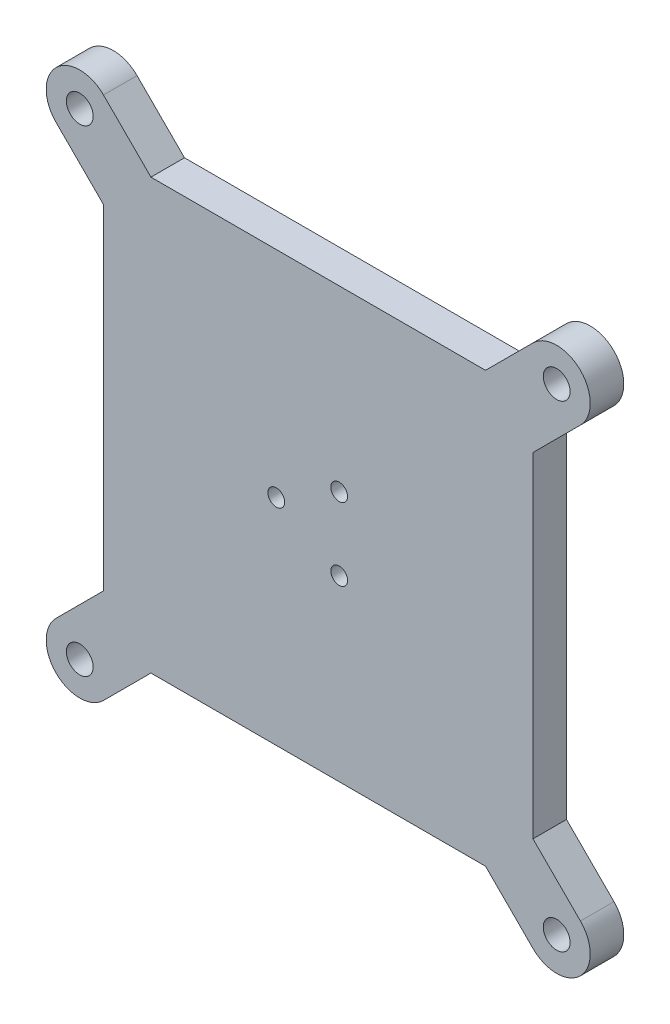
ISO-10303-21;
HEADER;
FILE_DESCRIPTION(('STEP AP214'),'2;1');
FILE_NAME('part.step','',(''),(''),'','','');
FILE_SCHEMA(('AUTOMOTIVE_DESIGN { 1 0 10303 214 1 1 1 1 }'));
ENDSEC;
DATA;
#1=APPLICATION_CONTEXT('core data for automotive mechanical design processes');
#2=APPLICATION_PROTOCOL_DEFINITION('international standard','automotive_design',2000,#1);
#3=PRODUCT_CONTEXT('',#1,'mechanical');
#4=PRODUCT('Part','Part','',(#3));
#5=PRODUCT_RELATED_PRODUCT_CATEGORY('part','',(#4));
#6=PRODUCT_DEFINITION_FORMATION('','',#4);
#7=PRODUCT_DEFINITION_CONTEXT('part definition',#1,'design');
#8=PRODUCT_DEFINITION('design','',#6,#7);
#9=PRODUCT_DEFINITION_SHAPE('','',#8);
#10=(LENGTH_UNIT() NAMED_UNIT(*) SI_UNIT(.MILLI.,.METRE.));
#11=(NAMED_UNIT(*) PLANE_ANGLE_UNIT() SI_UNIT($,.RADIAN.));
#12=(NAMED_UNIT(*) SI_UNIT($,.STERADIAN.) SOLID_ANGLE_UNIT());
#13=UNCERTAINTY_MEASURE_WITH_UNIT(LENGTH_MEASURE(1.E-05),#10,'distance_accuracy_value','');
#14=(GEOMETRIC_REPRESENTATION_CONTEXT(3) GLOBAL_UNCERTAINTY_ASSIGNED_CONTEXT((#13)) GLOBAL_UNIT_ASSIGNED_CONTEXT((#10,
#11,#12)) REPRESENTATION_CONTEXT('',''));
#15=CARTESIAN_POINT('',(0.,0.,0.));
#16=DIRECTION('',(0.,0.,1.));
#17=DIRECTION('',(1.,0.,0.));
#18=AXIS2_PLACEMENT_3D('',#15,#16,#17);
#19=CARTESIAN_POINT('',(3.125,-5.41265877365274,5.));
#20=DIRECTION('',(0.,0.,-1.));
#21=DIRECTION('',(-1.,0.,0.));
#22=AXIS2_PLACEMENT_3D('',#19,#20,#21);
#23=CYLINDRICAL_SURFACE('',#22,1.24999999999921);
#24=CARTESIAN_POINT('',(3.125,-5.41265877365274,5.));
#25=DIRECTION('',(0.,0.,1.));
#26=DIRECTION('',(1.,0.,0.));
#27=AXIS2_PLACEMENT_3D('',#24,#25,#26);
#28=CIRCLE('',#27,1.24999999999921);
#29=CARTESIAN_POINT('',(4.37499999999921,-5.41265877365274,5.));
#30=VERTEX_POINT('',#29);
#31=EDGE_CURVE('E185',#30,#30,#28,.T.);
#32=ORIENTED_EDGE('',*,*,#31,.T.);
#33=EDGE_LOOP('',(#32));
#34=FACE_BOUND('',#33,.T.);
#35=CARTESIAN_POINT('',(3.125,-5.41265877365274,1.5));
#36=DIRECTION('',(0.,0.,-1.));
#37=DIRECTION('',(-1.,0.,0.));
#38=AXIS2_PLACEMENT_3D('',#35,#36,#37);
#39=CIRCLE('',#38,1.24999999999921);
#40=CARTESIAN_POINT('',(1.87500000000079,-5.41265877365274,1.5));
#41=VERTEX_POINT('',#40);
#42=EDGE_CURVE('E37',#41,#41,#39,.T.);
#43=ORIENTED_EDGE('',*,*,#42,.T.);
#44=EDGE_LOOP('',(#43));
#45=FACE_BOUND('',#44,.T.);
#46=ADVANCED_FACE('F33',(#34,#45),#23,.F.);
#47=CARTESIAN_POINT('',(-6.25,0.,5.));
#48=DIRECTION('',(0.,0.,-1.));
#49=DIRECTION('',(-1.,0.,0.));
#50=AXIS2_PLACEMENT_3D('',#47,#48,#49);
#51=CYLINDRICAL_SURFACE('',#50,1.25000000000024);
#52=CARTESIAN_POINT('',(-6.25,0.,5.));
#53=DIRECTION('',(0.,0.,1.));
#54=DIRECTION('',(1.,0.,0.));
#55=AXIS2_PLACEMENT_3D('',#52,#53,#54);
#56=CIRCLE('',#55,1.25000000000024);
#57=CARTESIAN_POINT('',(-4.99999999999976,0.,5.));
#58=VERTEX_POINT('',#57);
#59=EDGE_CURVE('E289',#58,#58,#56,.T.);
#60=ORIENTED_EDGE('',*,*,#59,.T.);
#61=EDGE_LOOP('',(#60));
#62=FACE_BOUND('',#61,.T.);
#63=CARTESIAN_POINT('',(-6.25,0.,1.5));
#64=DIRECTION('',(0.,0.,-1.));
#65=DIRECTION('',(-1.,0.,0.));
#66=AXIS2_PLACEMENT_3D('',#63,#64,#65);
#67=CIRCLE('',#66,1.25000000000024);
#68=CARTESIAN_POINT('',(-7.50000000000024,0.,1.5));
#69=VERTEX_POINT('',#68);
#70=EDGE_CURVE('E250',#69,#69,#67,.T.);
#71=ORIENTED_EDGE('',*,*,#70,.T.);
#72=EDGE_LOOP('',(#71));
#73=FACE_BOUND('',#72,.T.);
#74=ADVANCED_FACE('F347',(#62,#73),#51,.F.);
#75=CARTESIAN_POINT('',(3.125,5.41265877365274,5.));
#76=DIRECTION('',(0.,0.,-1.));
#77=DIRECTION('',(-1.,0.,0.));
#78=AXIS2_PLACEMENT_3D('',#75,#76,#77);
#79=CYLINDRICAL_SURFACE('',#78,1.25000000000055);
#80=CARTESIAN_POINT('',(3.125,5.41265877365274,5.));
#81=DIRECTION('',(0.,0.,1.));
#82=DIRECTION('',(1.,0.,0.));
#83=AXIS2_PLACEMENT_3D('',#80,#81,#82);
#84=CIRCLE('',#83,1.25000000000055);
#85=CARTESIAN_POINT('',(4.37500000000055,5.41265877365274,5.));
#86=VERTEX_POINT('',#85);
#87=EDGE_CURVE('E284',#86,#86,#84,.T.);
#88=ORIENTED_EDGE('',*,*,#87,.T.);
#89=EDGE_LOOP('',(#88));
#90=FACE_BOUND('',#89,.T.);
#91=CARTESIAN_POINT('',(3.125,5.41265877365274,1.5));
#92=DIRECTION('',(0.,0.,-1.));
#93=DIRECTION('',(-1.,0.,0.));
#94=AXIS2_PLACEMENT_3D('',#91,#92,#93);
#95=CIRCLE('',#94,1.25000000000055);
#96=CARTESIAN_POINT('',(1.87499999999945,5.41265877365274,1.5));
#97=VERTEX_POINT('',#96);
#98=EDGE_CURVE('E248',#97,#97,#95,.T.);
#99=ORIENTED_EDGE('',*,*,#98,.T.);
#100=EDGE_LOOP('',(#99));
#101=FACE_BOUND('',#100,.T.);
#102=ADVANCED_FACE('F353',(#90,#101),#79,.F.);
#103=CARTESIAN_POINT('',(-35.5355339059324,-35.5355339059331,5.));
#104=DIRECTION('',(0.,0.,1.));
#105=DIRECTION('',(1.,0.,0.));
#106=AXIS2_PLACEMENT_3D('',#103,#104,#105);
#107=PLANE('',#106);
#108=CARTESIAN_POINT('',(35.5355339059326,35.5355339059329,5.));
#109=DIRECTION('',(0.,0.,1.));
#110=DIRECTION('',(1.,0.,0.));
#111=AXIS2_PLACEMENT_3D('',#108,#109,#110);
#112=CIRCLE('',#111,2.);
#113=CARTESIAN_POINT('',(37.5355339059326,35.5355339059329,5.));
#114=VERTEX_POINT('',#113);
#115=EDGE_CURVE('E269',#114,#114,#112,.T.);
#116=ORIENTED_EDGE('',*,*,#115,.F.);
#117=EDGE_LOOP('',(#116));
#118=FACE_BOUND('',#117,.T.);
#119=CARTESIAN_POINT('',(-35.5355339059324,-35.5355339059331,5.));
#120=DIRECTION('',(0.,0.,1.));
#121=DIRECTION('',(1.,0.,0.));
#122=AXIS2_PLACEMENT_3D('',#119,#120,#121);
#123=CIRCLE('',#122,2.);
#124=CARTESIAN_POINT('',(-33.5355339059324,-35.5355339059331,5.));
#125=VERTEX_POINT('',#124);
#126=EDGE_CURVE('E281',#125,#125,#123,.T.);
#127=ORIENTED_EDGE('',*,*,#126,.F.);
#128=EDGE_LOOP('',(#127));
#129=FACE_BOUND('',#128,.T.);
#130=ORIENTED_EDGE('',*,*,#59,.F.);
#131=EDGE_LOOP('',(#130));
#132=FACE_BOUND('',#131,.T.);
#133=DIRECTION('',(0.,-1.,0.));
#134=VECTOR('',#133,1.);
#135=CARTESIAN_POINT('',(-32.,24.9289321881345,5.));
#136=LINE('',#135,#134);
#137=CARTESIAN_POINT('',(-32.,24.9289321881345,5.));
#138=VERTEX_POINT('',#137);
#139=CARTESIAN_POINT('',(-32.,-24.9289321881352,5.));
#140=VERTEX_POINT('',#139);
#141=EDGE_CURVE('E212',#138,#140,#136,.T.);
#142=ORIENTED_EDGE('',*,*,#141,.T.);
#143=DIRECTION('',(-0.707106781186541,-0.707106781186555,0.));
#144=VECTOR('',#143,1.);
#145=CARTESIAN_POINT('',(-32.,-24.9289321881352,5.));
#146=LINE('',#145,#144);
#147=CARTESIAN_POINT('',(-39.0710678118651,-32.0000000000004,5.));
#148=VERTEX_POINT('',#147);
#149=EDGE_CURVE('E119',#140,#148,#146,.T.);
#150=ORIENTED_EDGE('',*,*,#149,.T.);
#151=CARTESIAN_POINT('',(-35.5355339059324,-35.5355339059331,5.));
#152=DIRECTION('',(0.,0.,1.));
#153=DIRECTION('',(1.,0.,0.));
#154=AXIS2_PLACEMENT_3D('',#151,#152,#153);
#155=CIRCLE('',#154,5.);
#156=CARTESIAN_POINT('',(-31.9999999999996,-39.0710678118658,5.));
#157=VERTEX_POINT('',#156);
#158=EDGE_CURVE('E296',#148,#157,#155,.T.);
#159=ORIENTED_EDGE('',*,*,#158,.T.);
#160=DIRECTION('',(0.70710678118654,0.707106781186555,0.));
#161=VECTOR('',#160,1.);
#162=CARTESIAN_POINT('',(-31.9999999999996,-39.0710678118658,5.));
#163=LINE('',#162,#161);
#164=CARTESIAN_POINT('',(-24.9289321881339,-32.,5.));
#165=VERTEX_POINT('',#164);
#166=EDGE_CURVE('E298',#157,#165,#163,.T.);
#167=ORIENTED_EDGE('',*,*,#166,.T.);
#168=DIRECTION('',(1.,0.,0.));
#169=VECTOR('',#168,1.);
#170=CARTESIAN_POINT('',(-24.9289321881339,-32.,5.));
#171=LINE('',#170,#169);
#172=CARTESIAN_POINT('',(24.9289321881345,-32.,5.));
#173=VERTEX_POINT('',#172);
#174=EDGE_CURVE('E300',#165,#173,#171,.T.);
#175=ORIENTED_EDGE('',*,*,#174,.T.);
#176=DIRECTION('',(0.707106781186547,-0.707106781186548,0.));
#177=VECTOR('',#176,1.);
#178=CARTESIAN_POINT('',(24.9289321881345,-32.,5.));
#179=LINE('',#178,#177);
#180=CARTESIAN_POINT('',(32.,-39.0710678118655,5.));
#181=VERTEX_POINT('',#180);
#182=EDGE_CURVE('E302',#173,#181,#179,.T.);
#183=ORIENTED_EDGE('',*,*,#182,.T.);
#184=CARTESIAN_POINT('',(35.5355339059327,-35.5355339059327,5.));
#185=DIRECTION('',(0.,0.,1.));
#186=DIRECTION('',(1.,0.,0.));
#187=AXIS2_PLACEMENT_3D('',#184,#185,#186);
#188=CIRCLE('',#187,5.);
#189=CARTESIAN_POINT('',(39.0710678118655,-32.,5.));
#190=VERTEX_POINT('',#189);
#191=EDGE_CURVE('E304',#181,#190,#188,.T.);
#192=ORIENTED_EDGE('',*,*,#191,.T.);
#193=DIRECTION('',(-0.707106781186548,0.707106781186547,0.));
#194=VECTOR('',#193,1.);
#195=CARTESIAN_POINT('',(39.0710678118655,-32.,5.));
#196=LINE('',#195,#194);
#197=CARTESIAN_POINT('',(32.,-24.9289321881345,5.));
#198=VERTEX_POINT('',#197);
#199=EDGE_CURVE('E306',#190,#198,#196,.T.);
#200=ORIENTED_EDGE('',*,*,#199,.T.);
#201=DIRECTION('',(0.,1.,0.));
#202=VECTOR('',#201,1.);
#203=CARTESIAN_POINT('',(32.,-24.9289321881345,5.));
#204=LINE('',#203,#202);
#205=CARTESIAN_POINT('',(32.,24.9289321881347,5.));
#206=VERTEX_POINT('',#205);
#207=EDGE_CURVE('E308',#198,#206,#204,.T.);
#208=ORIENTED_EDGE('',*,*,#207,.T.);
#209=DIRECTION('',(0.707106781186545,0.70710678118655,0.));
#210=VECTOR('',#209,1.);
#211=CARTESIAN_POINT('',(32.,24.9289321881347,5.));
#212=LINE('',#211,#210);
#213=CARTESIAN_POINT('',(39.0710678118654,32.0000000000001,5.));
#214=VERTEX_POINT('',#213);
#215=EDGE_CURVE('E310',#206,#214,#212,.T.);
#216=ORIENTED_EDGE('',*,*,#215,.T.);
#217=CARTESIAN_POINT('',(35.5355339059326,35.5355339059329,5.));
#218=DIRECTION('',(0.,0.,1.));
#219=DIRECTION('',(1.,0.,0.));
#220=AXIS2_PLACEMENT_3D('',#217,#218,#219);
#221=CIRCLE('',#220,5.);
#222=CARTESIAN_POINT('',(31.9999999999999,39.0710678118656,5.));
#223=VERTEX_POINT('',#222);
#224=EDGE_CURVE('E312',#214,#223,#221,.T.);
#225=ORIENTED_EDGE('',*,*,#224,.T.);
#226=DIRECTION('',(-0.707106781186545,-0.70710678118655,0.));
#227=VECTOR('',#226,1.);
#228=CARTESIAN_POINT('',(31.9999999999999,39.0710678118656,5.));
#229=LINE('',#228,#227);
#230=CARTESIAN_POINT('',(24.9289321881343,32.,5.));
#231=VERTEX_POINT('',#230);
#232=EDGE_CURVE('E314',#223,#231,#229,.T.);
#233=ORIENTED_EDGE('',*,*,#232,.T.);
#234=DIRECTION('',(-1.,0.,0.));
#235=VECTOR('',#234,1.);
#236=CARTESIAN_POINT('',(24.9289321881343,32.,5.));
#237=LINE('',#236,#235);
#238=CARTESIAN_POINT('',(-24.9289321881345,32.,5.));
#239=VERTEX_POINT('',#238);
#240=EDGE_CURVE('E163',#231,#239,#237,.T.);
#241=ORIENTED_EDGE('',*,*,#240,.T.);
#242=DIRECTION('',(-0.707106781186547,0.707106781186547,0.));
#243=VECTOR('',#242,1.);
#244=CARTESIAN_POINT('',(-24.9289321881345,32.,5.));
#245=LINE('',#244,#243);
#246=CARTESIAN_POINT('',(-32.,39.0710678118655,5.));
#247=VERTEX_POINT('',#246);
#248=EDGE_CURVE('E156',#239,#247,#245,.T.);
#249=ORIENTED_EDGE('',*,*,#248,.T.);
#250=CARTESIAN_POINT('',(-35.5355339059327,35.5355339059327,5.));
#251=DIRECTION('',(0.,0.,1.));
#252=DIRECTION('',(1.,0.,0.));
#253=AXIS2_PLACEMENT_3D('',#250,#251,#252);
#254=CIRCLE('',#253,5.);
#255=CARTESIAN_POINT('',(-39.0710678118655,32.,5.));
#256=VERTEX_POINT('',#255);
#257=EDGE_CURVE('E161',#247,#256,#254,.T.);
#258=ORIENTED_EDGE('',*,*,#257,.T.);
#259=DIRECTION('',(0.707106781186547,-0.707106781186547,0.));
#260=VECTOR('',#259,1.);
#261=CARTESIAN_POINT('',(-39.0710678118655,32.,5.));
#262=LINE('',#261,#260);
#263=EDGE_CURVE('E52',#256,#138,#262,.T.);
#264=ORIENTED_EDGE('',*,*,#263,.T.);
#265=EDGE_LOOP('',(#142,#150,#159,#167,#175,#183,#192,#200,#208,#216,#225,#233,#241,#249,#258,#264));
#266=FACE_BOUND('',#265,.T.);
#267=ORIENTED_EDGE('',*,*,#31,.F.);
#268=EDGE_LOOP('',(#267));
#269=FACE_BOUND('',#268,.T.);
#270=ORIENTED_EDGE('',*,*,#87,.F.);
#271=EDGE_LOOP('',(#270));
#272=FACE_BOUND('',#271,.T.);
#273=CARTESIAN_POINT('',(35.5355339059327,-35.5355339059327,5.));
#274=DIRECTION('',(0.,0.,1.));
#275=DIRECTION('',(1.,0.,0.));
#276=AXIS2_PLACEMENT_3D('',#273,#274,#275);
#277=CIRCLE('',#276,2.);
#278=CARTESIAN_POINT('',(37.5355339059327,-35.5355339059327,5.));
#279=VERTEX_POINT('',#278);
#280=EDGE_CURVE('E275',#279,#279,#277,.T.);
#281=ORIENTED_EDGE('',*,*,#280,.F.);
#282=EDGE_LOOP('',(#281));
#283=FACE_BOUND('',#282,.T.);
#284=CARTESIAN_POINT('',(-35.5355339059327,35.5355339059327,5.));
#285=DIRECTION('',(0.,0.,1.));
#286=DIRECTION('',(1.,0.,0.));
#287=AXIS2_PLACEMENT_3D('',#284,#285,#286);
#288=CIRCLE('',#287,2.);
#289=CARTESIAN_POINT('',(-33.5355339059327,35.5355339059327,5.));
#290=VERTEX_POINT('',#289);
#291=EDGE_CURVE('E260',#290,#290,#288,.T.);
#292=ORIENTED_EDGE('',*,*,#291,.F.);
#293=EDGE_LOOP('',(#292));
#294=FACE_BOUND('',#293,.T.);
#295=ADVANCED_FACE('F158',(#118,#129,#132,#266,#269,#272,#283,#294),#107,.T.);
#296=CARTESIAN_POINT('',(-35.5355339059324,-35.5355339059331,0.));
#297=DIRECTION('',(0.,0.,1.));
#298=DIRECTION('',(1.,0.,0.));
#299=AXIS2_PLACEMENT_3D('',#296,#297,#298);
#300=PLANE('',#299);
#301=CARTESIAN_POINT('',(3.125,5.41265877365274,0.));
#302=DIRECTION('',(0.,0.,-1.));
#303=DIRECTION('',(-1.,0.,0.));
#304=AXIS2_PLACEMENT_3D('',#301,#302,#303);
#305=CIRCLE('',#304,2.25000000000055);
#306=CARTESIAN_POINT('',(0.874999999999447,5.41265877365274,0.));
#307=VERTEX_POINT('',#306);
#308=EDGE_CURVE('E369',#307,#307,#305,.T.);
#309=ORIENTED_EDGE('',*,*,#308,.F.);
#310=EDGE_LOOP('',(#309));
#311=FACE_BOUND('',#310,.T.);
#312=CARTESIAN_POINT('',(3.125,-5.41265877365274,0.));
#313=DIRECTION('',(0.,0.,-1.));
#314=DIRECTION('',(-1.,0.,0.));
#315=AXIS2_PLACEMENT_3D('',#312,#313,#314);
#316=CIRCLE('',#315,2.24999999999921);
#317=CARTESIAN_POINT('',(0.875000000000792,-5.41265877365274,0.));
#318=VERTEX_POINT('',#317);
#319=EDGE_CURVE('E373',#318,#318,#316,.T.);
#320=ORIENTED_EDGE('',*,*,#319,.F.);
#321=EDGE_LOOP('',(#320));
#322=FACE_BOUND('',#321,.T.);
#323=CARTESIAN_POINT('',(-6.25,0.,0.));
#324=DIRECTION('',(0.,0.,-1.));
#325=DIRECTION('',(-1.,0.,0.));
#326=AXIS2_PLACEMENT_3D('',#323,#324,#325);
#327=CIRCLE('',#326,2.25000000000024);
#328=CARTESIAN_POINT('',(-8.50000000000024,0.,0.));
#329=VERTEX_POINT('',#328);
#330=EDGE_CURVE('E376',#329,#329,#327,.T.);
#331=ORIENTED_EDGE('',*,*,#330,.F.);
#332=EDGE_LOOP('',(#331));
#333=FACE_BOUND('',#332,.T.);
#334=DIRECTION('',(0.,-1.,0.));
#335=VECTOR('',#334,1.);
#336=CARTESIAN_POINT('',(-32.,24.9289321881345,0.));
#337=LINE('',#336,#335);
#338=CARTESIAN_POINT('',(-32.,24.9289321881345,0.));
#339=VERTEX_POINT('',#338);
#340=CARTESIAN_POINT('',(-32.,-24.9289321881352,0.));
#341=VERTEX_POINT('',#340);
#342=EDGE_CURVE('E181',#339,#341,#337,.T.);
#343=ORIENTED_EDGE('',*,*,#342,.F.);
#344=DIRECTION('',(0.707106781186547,-0.707106781186547,0.));
#345=VECTOR('',#344,1.);
#346=CARTESIAN_POINT('',(-39.0710678118655,32.,0.));
#347=LINE('',#346,#345);
#348=CARTESIAN_POINT('',(-39.0710678118655,32.,0.));
#349=VERTEX_POINT('',#348);
#350=EDGE_CURVE('E111',#349,#339,#347,.T.);
#351=ORIENTED_EDGE('',*,*,#350,.F.);
#352=CARTESIAN_POINT('',(-35.5355339059327,35.5355339059327,0.));
#353=DIRECTION('',(0.,0.,1.));
#354=DIRECTION('',(1.,0.,0.));
#355=AXIS2_PLACEMENT_3D('',#352,#353,#354);
#356=CIRCLE('',#355,5.);
#357=CARTESIAN_POINT('',(-32.,39.0710678118655,0.));
#358=VERTEX_POINT('',#357);
#359=EDGE_CURVE('E105',#358,#349,#356,.T.);
#360=ORIENTED_EDGE('',*,*,#359,.F.);
#361=DIRECTION('',(-0.707106781186547,0.707106781186547,0.));
#362=VECTOR('',#361,1.);
#363=CARTESIAN_POINT('',(-24.9289321881345,32.,0.));
#364=LINE('',#363,#362);
#365=CARTESIAN_POINT('',(-24.9289321881345,32.,0.));
#366=VERTEX_POINT('',#365);
#367=EDGE_CURVE('E171',#366,#358,#364,.T.);
#368=ORIENTED_EDGE('',*,*,#367,.F.);
#369=DIRECTION('',(-1.,0.,0.));
#370=VECTOR('',#369,1.);
#371=CARTESIAN_POINT('',(24.9289321881343,32.,0.));
#372=LINE('',#371,#370);
#373=CARTESIAN_POINT('',(24.9289321881343,32.,0.));
#374=VERTEX_POINT('',#373);
#375=EDGE_CURVE('E207',#374,#366,#372,.T.);
#376=ORIENTED_EDGE('',*,*,#375,.F.);
#377=DIRECTION('',(-0.707106781186545,-0.70710678118655,0.));
#378=VECTOR('',#377,1.);
#379=CARTESIAN_POINT('',(31.9999999999999,39.0710678118656,0.));
#380=LINE('',#379,#378);
#381=CARTESIAN_POINT('',(31.9999999999999,39.0710678118656,0.));
#382=VERTEX_POINT('',#381);
#383=EDGE_CURVE('E205',#382,#374,#380,.T.);
#384=ORIENTED_EDGE('',*,*,#383,.F.);
#385=CARTESIAN_POINT('',(35.5355339059326,35.5355339059329,0.));
#386=DIRECTION('',(0.,0.,1.));
#387=DIRECTION('',(1.,0.,0.));
#388=AXIS2_PLACEMENT_3D('',#385,#386,#387);
#389=CIRCLE('',#388,5.);
#390=CARTESIAN_POINT('',(39.0710678118654,32.0000000000001,0.));
#391=VERTEX_POINT('',#390);
#392=EDGE_CURVE('E203',#391,#382,#389,.T.);
#393=ORIENTED_EDGE('',*,*,#392,.F.);
#394=DIRECTION('',(0.707106781186545,0.70710678118655,0.));
#395=VECTOR('',#394,1.);
#396=CARTESIAN_POINT('',(32.,24.9289321881347,0.));
#397=LINE('',#396,#395);
#398=CARTESIAN_POINT('',(32.,24.9289321881347,0.));
#399=VERTEX_POINT('',#398);
#400=EDGE_CURVE('E201',#399,#391,#397,.T.);
#401=ORIENTED_EDGE('',*,*,#400,.F.);
#402=DIRECTION('',(0.,1.,0.));
#403=VECTOR('',#402,1.);
#404=CARTESIAN_POINT('',(32.,-24.9289321881345,0.));
#405=LINE('',#404,#403);
#406=CARTESIAN_POINT('',(32.,-24.9289321881345,0.));
#407=VERTEX_POINT('',#406);
#408=EDGE_CURVE('E199',#407,#399,#405,.T.);
#409=ORIENTED_EDGE('',*,*,#408,.F.);
#410=DIRECTION('',(-0.707106781186548,0.707106781186547,0.));
#411=VECTOR('',#410,1.);
#412=CARTESIAN_POINT('',(39.0710678118655,-32.,0.));
#413=LINE('',#412,#411);
#414=CARTESIAN_POINT('',(39.0710678118655,-32.,0.));
#415=VERTEX_POINT('',#414);
#416=EDGE_CURVE('E197',#415,#407,#413,.T.);
#417=ORIENTED_EDGE('',*,*,#416,.F.);
#418=CARTESIAN_POINT('',(35.5355339059327,-35.5355339059327,0.));
#419=DIRECTION('',(0.,0.,1.));
#420=DIRECTION('',(1.,0.,0.));
#421=AXIS2_PLACEMENT_3D('',#418,#419,#420);
#422=CIRCLE('',#421,5.);
#423=CARTESIAN_POINT('',(32.,-39.0710678118655,0.));
#424=VERTEX_POINT('',#423);
#425=EDGE_CURVE('E195',#424,#415,#422,.T.);
#426=ORIENTED_EDGE('',*,*,#425,.F.);
#427=DIRECTION('',(0.707106781186547,-0.707106781186548,0.));
#428=VECTOR('',#427,1.);
#429=CARTESIAN_POINT('',(24.9289321881345,-32.,0.));
#430=LINE('',#429,#428);
#431=CARTESIAN_POINT('',(24.9289321881345,-32.,0.));
#432=VERTEX_POINT('',#431);
#433=EDGE_CURVE('E193',#432,#424,#430,.T.);
#434=ORIENTED_EDGE('',*,*,#433,.F.);
#435=DIRECTION('',(1.,0.,0.));
#436=VECTOR('',#435,1.);
#437=CARTESIAN_POINT('',(-24.9289321881339,-32.,0.));
#438=LINE('',#437,#436);
#439=CARTESIAN_POINT('',(-24.9289321881339,-32.,0.));
#440=VERTEX_POINT('',#439);
#441=EDGE_CURVE('E191',#440,#432,#438,.T.);
#442=ORIENTED_EDGE('',*,*,#441,.F.);
#443=DIRECTION('',(0.70710678118654,0.707106781186555,0.));
#444=VECTOR('',#443,1.);
#445=CARTESIAN_POINT('',(-31.9999999999996,-39.0710678118658,0.));
#446=LINE('',#445,#444);
#447=CARTESIAN_POINT('',(-31.9999999999996,-39.0710678118658,0.));
#448=VERTEX_POINT('',#447);
#449=EDGE_CURVE('E189',#448,#440,#446,.T.);
#450=ORIENTED_EDGE('',*,*,#449,.F.);
#451=CARTESIAN_POINT('',(-35.5355339059324,-35.5355339059331,0.));
#452=DIRECTION('',(0.,0.,1.));
#453=DIRECTION('',(1.,0.,0.));
#454=AXIS2_PLACEMENT_3D('',#451,#452,#453);
#455=CIRCLE('',#454,5.);
#456=CARTESIAN_POINT('',(-39.0710678118651,-32.0000000000004,0.));
#457=VERTEX_POINT('',#456);
#458=EDGE_CURVE('E187',#457,#448,#455,.T.);
#459=ORIENTED_EDGE('',*,*,#458,.F.);
#460=DIRECTION('',(-0.707106781186541,-0.707106781186555,0.));
#461=VECTOR('',#460,1.);
#462=CARTESIAN_POINT('',(-32.,-24.9289321881352,0.));
#463=LINE('',#462,#461);
#464=EDGE_CURVE('E184',#341,#457,#463,.T.);
#465=ORIENTED_EDGE('',*,*,#464,.F.);
#466=EDGE_LOOP('',(#343,#351,#360,#368,#376,#384,#393,#401,#409,#417,#426,#434,#442,#450,#459,#465));
#467=FACE_BOUND('',#466,.T.);
#468=CARTESIAN_POINT('',(-35.5355339059324,-35.5355339059331,0.));
#469=DIRECTION('',(0.,0.,1.));
#470=DIRECTION('',(1.,0.,0.));
#471=AXIS2_PLACEMENT_3D('',#468,#469,#470);
#472=CIRCLE('',#471,2.);
#473=CARTESIAN_POINT('',(-33.5355339059324,-35.5355339059331,0.));
#474=VERTEX_POINT('',#473);
#475=EDGE_CURVE('E278',#474,#474,#472,.T.);
#476=ORIENTED_EDGE('',*,*,#475,.T.);
#477=EDGE_LOOP('',(#476));
#478=FACE_BOUND('',#477,.T.);
#479=CARTESIAN_POINT('',(35.5355339059327,-35.5355339059327,0.));
#480=DIRECTION('',(0.,0.,1.));
#481=DIRECTION('',(1.,0.,0.));
#482=AXIS2_PLACEMENT_3D('',#479,#480,#481);
#483=CIRCLE('',#482,2.);
#484=CARTESIAN_POINT('',(37.5355339059327,-35.5355339059327,0.));
#485=VERTEX_POINT('',#484);
#486=EDGE_CURVE('E272',#485,#485,#483,.T.);
#487=ORIENTED_EDGE('',*,*,#486,.T.);
#488=EDGE_LOOP('',(#487));
#489=FACE_BOUND('',#488,.T.);
#490=CARTESIAN_POINT('',(35.5355339059326,35.5355339059329,0.));
#491=DIRECTION('',(0.,0.,1.));
#492=DIRECTION('',(1.,0.,0.));
#493=AXIS2_PLACEMENT_3D('',#490,#491,#492);
#494=CIRCLE('',#493,2.);
#495=CARTESIAN_POINT('',(37.5355339059326,35.5355339059329,0.));
#496=VERTEX_POINT('',#495);
#497=EDGE_CURVE('E265',#496,#496,#494,.T.);
#498=ORIENTED_EDGE('',*,*,#497,.T.);
#499=EDGE_LOOP('',(#498));
#500=FACE_BOUND('',#499,.T.);
#501=CARTESIAN_POINT('',(-35.5355339059327,35.5355339059327,0.));
#502=DIRECTION('',(0.,0.,1.));
#503=DIRECTION('',(1.,0.,0.));
#504=AXIS2_PLACEMENT_3D('',#501,#502,#503);
#505=CIRCLE('',#504,2.);
#506=CARTESIAN_POINT('',(-33.5355339059327,35.5355339059327,0.));
#507=VERTEX_POINT('',#506);
#508=EDGE_CURVE('E256',#507,#507,#505,.T.);
#509=ORIENTED_EDGE('',*,*,#508,.T.);
#510=EDGE_LOOP('',(#509));
#511=FACE_BOUND('',#510,.T.);
#512=ADVANCED_FACE('F327',(#311,#322,#333,#467,#478,#489,#500,#511),#300,.F.);
#513=CARTESIAN_POINT('',(-32.,24.9289321881345,5.));
#514=DIRECTION('',(1.,0.,0.));
#515=DIRECTION('',(0.,1.,0.));
#516=AXIS2_PLACEMENT_3D('',#513,#514,#515);
#517=PLANE('',#516);
#518=ORIENTED_EDGE('',*,*,#342,.T.);
#519=DIRECTION('',(0.,0.,-1.));
#520=VECTOR('',#519,1.);
#521=CARTESIAN_POINT('',(-32.,-24.9289321881352,5.));
#522=LINE('',#521,#520);
#523=EDGE_CURVE('E11',#140,#341,#522,.T.);
#524=ORIENTED_EDGE('',*,*,#523,.F.);
#525=ORIENTED_EDGE('',*,*,#141,.F.);
#526=DIRECTION('',(0.,0.,-1.));
#527=VECTOR('',#526,1.);
#528=CARTESIAN_POINT('',(-32.,24.9289321881345,5.));
#529=LINE('',#528,#527);
#530=EDGE_CURVE('E177',#138,#339,#529,.T.);
#531=ORIENTED_EDGE('',*,*,#530,.T.);
#532=EDGE_LOOP('',(#518,#524,#525,#531));
#533=FACE_BOUND('',#532,.T.);
#534=ADVANCED_FACE('F35',(#533),#517,.F.);
#535=CARTESIAN_POINT('',(-32.,-24.9289321881352,5.));
#536=DIRECTION('',(0.707106781186555,-0.707106781186541,0.));
#537=DIRECTION('',(0.707106781186541,0.707106781186554,0.));
#538=AXIS2_PLACEMENT_3D('',#535,#536,#537);
#539=PLANE('',#538);
#540=ORIENTED_EDGE('',*,*,#464,.T.);
#541=DIRECTION('',(0.,0.,-1.));
#542=VECTOR('',#541,1.);
#543=CARTESIAN_POINT('',(-39.0710678118651,-32.0000000000004,5.));
#544=LINE('',#543,#542);
#545=EDGE_CURVE('E43',#148,#457,#544,.T.);
#546=ORIENTED_EDGE('',*,*,#545,.F.);
#547=ORIENTED_EDGE('',*,*,#149,.F.);
#548=ORIENTED_EDGE('',*,*,#523,.T.);
#549=EDGE_LOOP('',(#540,#546,#547,#548));
#550=FACE_BOUND('',#549,.T.);
#551=ADVANCED_FACE('F365',(#550),#539,.F.);
#552=CARTESIAN_POINT('',(-35.5355339059324,-35.5355339059331,5.));
#553=DIRECTION('',(0.,0.,-1.));
#554=DIRECTION('',(-1.,0.,0.));
#555=AXIS2_PLACEMENT_3D('',#552,#553,#554);
#556=CYLINDRICAL_SURFACE('',#555,5.);
#557=ORIENTED_EDGE('',*,*,#458,.T.);
#558=DIRECTION('',(0.,0.,-1.));
#559=VECTOR('',#558,1.);
#560=CARTESIAN_POINT('',(-31.9999999999996,-39.0710678118658,5.));
#561=LINE('',#560,#559);
#562=EDGE_CURVE('E243',#157,#448,#561,.T.);
#563=ORIENTED_EDGE('',*,*,#562,.F.);
#564=ORIENTED_EDGE('',*,*,#158,.F.);
#565=ORIENTED_EDGE('',*,*,#545,.T.);
#566=EDGE_LOOP('',(#557,#563,#564,#565));
#567=FACE_BOUND('',#566,.T.);
#568=ADVANCED_FACE('F469',(#567),#556,.T.);
#569=CARTESIAN_POINT('',(-31.9999999999996,-39.0710678118658,5.));
#570=DIRECTION('',(-0.707106781186555,0.70710678118654,0.));
#571=DIRECTION('',(-0.70710678118654,-0.707106781186555,0.));
#572=AXIS2_PLACEMENT_3D('',#569,#570,#571);
#573=PLANE('',#572);
#574=ORIENTED_EDGE('',*,*,#449,.T.);
#575=DIRECTION('',(0.,0.,-1.));
#576=VECTOR('',#575,1.);
#577=CARTESIAN_POINT('',(-24.9289321881339,-32.,5.));
#578=LINE('',#577,#576);
#579=EDGE_CURVE('E240',#165,#440,#578,.T.);
#580=ORIENTED_EDGE('',*,*,#579,.F.);
#581=ORIENTED_EDGE('',*,*,#166,.F.);
#582=ORIENTED_EDGE('',*,*,#562,.T.);
#583=EDGE_LOOP('',(#574,#580,#581,#582));
#584=FACE_BOUND('',#583,.T.);
#585=ADVANCED_FACE('F477',(#584),#573,.F.);
#586=CARTESIAN_POINT('',(-24.9289321881339,-32.,5.));
#587=DIRECTION('',(0.,1.,0.));
#588=DIRECTION('',(0.,0.,1.));
#589=AXIS2_PLACEMENT_3D('',#586,#587,#588);
#590=PLANE('',#589);
#591=ORIENTED_EDGE('',*,*,#441,.T.);
#592=DIRECTION('',(0.,0.,-1.));
#593=VECTOR('',#592,1.);
#594=CARTESIAN_POINT('',(24.9289321881345,-32.,5.));
#595=LINE('',#594,#593);
#596=EDGE_CURVE('E237',#173,#432,#595,.T.);
#597=ORIENTED_EDGE('',*,*,#596,.F.);
#598=ORIENTED_EDGE('',*,*,#174,.F.);
#599=ORIENTED_EDGE('',*,*,#579,.T.);
#600=EDGE_LOOP('',(#591,#597,#598,#599));
#601=FACE_BOUND('',#600,.T.);
#602=ADVANCED_FACE('F487',(#601),#590,.F.);
#603=CARTESIAN_POINT('',(24.9289321881345,-32.,5.));
#604=DIRECTION('',(0.707106781186548,0.707106781186547,0.));
#605=DIRECTION('',(-0.707106781186547,0.707106781186548,0.));
#606=AXIS2_PLACEMENT_3D('',#603,#604,#605);
#607=PLANE('',#606);
#608=ORIENTED_EDGE('',*,*,#433,.T.);
#609=DIRECTION('',(0.,0.,-1.));
#610=VECTOR('',#609,1.);
#611=CARTESIAN_POINT('',(32.,-39.0710678118655,5.));
#612=LINE('',#611,#610);
#613=EDGE_CURVE('E234',#181,#424,#612,.T.);
#614=ORIENTED_EDGE('',*,*,#613,.F.);
#615=ORIENTED_EDGE('',*,*,#182,.F.);
#616=ORIENTED_EDGE('',*,*,#596,.T.);
#617=EDGE_LOOP('',(#608,#614,#615,#616));
#618=FACE_BOUND('',#617,.T.);
#619=ADVANCED_FACE('F497',(#618),#607,.F.);
#620=CARTESIAN_POINT('',(35.5355339059327,-35.5355339059327,5.));
#621=DIRECTION('',(0.,0.,-1.));
#622=DIRECTION('',(-1.,0.,0.));
#623=AXIS2_PLACEMENT_3D('',#620,#621,#622);
#624=CYLINDRICAL_SURFACE('',#623,5.);
#625=ORIENTED_EDGE('',*,*,#425,.T.);
#626=DIRECTION('',(0.,0.,-1.));
#627=VECTOR('',#626,1.);
#628=CARTESIAN_POINT('',(39.0710678118655,-32.,5.));
#629=LINE('',#628,#627);
#630=EDGE_CURVE('E231',#190,#415,#629,.T.);
#631=ORIENTED_EDGE('',*,*,#630,.F.);
#632=ORIENTED_EDGE('',*,*,#191,.F.);
#633=ORIENTED_EDGE('',*,*,#613,.T.);
#634=EDGE_LOOP('',(#625,#631,#632,#633));
#635=FACE_BOUND('',#634,.T.);
#636=ADVANCED_FACE('F507',(#635),#624,.T.);
#637=CARTESIAN_POINT('',(39.0710678118655,-32.,5.));
#638=DIRECTION('',(-0.707106781186547,-0.707106781186548,0.));
#639=DIRECTION('',(0.707106781186548,-0.707106781186547,0.));
#640=AXIS2_PLACEMENT_3D('',#637,#638,#639);
#641=PLANE('',#640);
#642=ORIENTED_EDGE('',*,*,#416,.T.);
#643=DIRECTION('',(0.,0.,-1.));
#644=VECTOR('',#643,1.);
#645=CARTESIAN_POINT('',(32.,-24.9289321881345,5.));
#646=LINE('',#645,#644);
#647=EDGE_CURVE('E228',#198,#407,#646,.T.);
#648=ORIENTED_EDGE('',*,*,#647,.F.);
#649=ORIENTED_EDGE('',*,*,#199,.F.);
#650=ORIENTED_EDGE('',*,*,#630,.T.);
#651=EDGE_LOOP('',(#642,#648,#649,#650));
#652=FACE_BOUND('',#651,.T.);
#653=ADVANCED_FACE('F517',(#652),#641,.F.);
#654=CARTESIAN_POINT('',(32.,-24.9289321881345,5.));
#655=DIRECTION('',(-1.,0.,0.));
#656=DIRECTION('',(0.,0.,1.));
#657=AXIS2_PLACEMENT_3D('',#654,#655,#656);
#658=PLANE('',#657);
#659=ORIENTED_EDGE('',*,*,#408,.T.);
#660=DIRECTION('',(0.,0.,-1.));
#661=VECTOR('',#660,1.);
#662=CARTESIAN_POINT('',(32.,24.9289321881347,5.));
#663=LINE('',#662,#661);
#664=EDGE_CURVE('E225',#206,#399,#663,.T.);
#665=ORIENTED_EDGE('',*,*,#664,.F.);
#666=ORIENTED_EDGE('',*,*,#207,.F.);
#667=ORIENTED_EDGE('',*,*,#647,.T.);
#668=EDGE_LOOP('',(#659,#665,#666,#667));
#669=FACE_BOUND('',#668,.T.);
#670=ADVANCED_FACE('F527',(#669),#658,.F.);
#671=CARTESIAN_POINT('',(32.,24.9289321881347,5.));
#672=DIRECTION('',(-0.70710678118655,0.707106781186545,0.));
#673=DIRECTION('',(-0.707106781186545,-0.70710678118655,0.));
#674=AXIS2_PLACEMENT_3D('',#671,#672,#673);
#675=PLANE('',#674);
#676=ORIENTED_EDGE('',*,*,#400,.T.);
#677=DIRECTION('',(0.,0.,-1.));
#678=VECTOR('',#677,1.);
#679=CARTESIAN_POINT('',(39.0710678118654,32.0000000000001,5.));
#680=LINE('',#679,#678);
#681=EDGE_CURVE('E222',#214,#391,#680,.T.);
#682=ORIENTED_EDGE('',*,*,#681,.F.);
#683=ORIENTED_EDGE('',*,*,#215,.F.);
#684=ORIENTED_EDGE('',*,*,#664,.T.);
#685=EDGE_LOOP('',(#676,#682,#683,#684));
#686=FACE_BOUND('',#685,.T.);
#687=ADVANCED_FACE('F537',(#686),#675,.F.);
#688=CARTESIAN_POINT('',(35.5355339059326,35.5355339059329,5.));
#689=DIRECTION('',(0.,0.,-1.));
#690=DIRECTION('',(-1.,0.,0.));
#691=AXIS2_PLACEMENT_3D('',#688,#689,#690);
#692=CYLINDRICAL_SURFACE('',#691,5.);
#693=ORIENTED_EDGE('',*,*,#392,.T.);
#694=DIRECTION('',(0.,0.,-1.));
#695=VECTOR('',#694,1.);
#696=CARTESIAN_POINT('',(31.9999999999999,39.0710678118656,5.));
#697=LINE('',#696,#695);
#698=EDGE_CURVE('E219',#223,#382,#697,.T.);
#699=ORIENTED_EDGE('',*,*,#698,.F.);
#700=ORIENTED_EDGE('',*,*,#224,.F.);
#701=ORIENTED_EDGE('',*,*,#681,.T.);
#702=EDGE_LOOP('',(#693,#699,#700,#701));
#703=FACE_BOUND('',#702,.T.);
#704=ADVANCED_FACE('F547',(#703),#692,.T.);
#705=CARTESIAN_POINT('',(31.9999999999999,39.0710678118656,5.));
#706=DIRECTION('',(0.70710678118655,-0.707106781186545,0.));
#707=DIRECTION('',(0.707106781186545,0.70710678118655,0.));
#708=AXIS2_PLACEMENT_3D('',#705,#706,#707);
#709=PLANE('',#708);
#710=ORIENTED_EDGE('',*,*,#383,.T.);
#711=DIRECTION('',(0.,0.,-1.));
#712=VECTOR('',#711,1.);
#713=CARTESIAN_POINT('',(24.9289321881343,32.,5.));
#714=LINE('',#713,#712);
#715=EDGE_CURVE('E216',#231,#374,#714,.T.);
#716=ORIENTED_EDGE('',*,*,#715,.F.);
#717=ORIENTED_EDGE('',*,*,#232,.F.);
#718=ORIENTED_EDGE('',*,*,#698,.T.);
#719=EDGE_LOOP('',(#710,#716,#717,#718));
#720=FACE_BOUND('',#719,.T.);
#721=ADVANCED_FACE('F320',(#720),#709,.F.);
#722=CARTESIAN_POINT('',(24.9289321881343,32.,5.));
#723=DIRECTION('',(0.,-1.,0.));
#724=DIRECTION('',(0.,0.,-1.));
#725=AXIS2_PLACEMENT_3D('',#722,#723,#724);
#726=PLANE('',#725);
#727=ORIENTED_EDGE('',*,*,#375,.T.);
#728=DIRECTION('',(0.,0.,-1.));
#729=VECTOR('',#728,1.);
#730=CARTESIAN_POINT('',(-24.9289321881345,32.,5.));
#731=LINE('',#730,#729);
#732=EDGE_CURVE('E172',#239,#366,#731,.T.);
#733=ORIENTED_EDGE('',*,*,#732,.F.);
#734=ORIENTED_EDGE('',*,*,#240,.F.);
#735=ORIENTED_EDGE('',*,*,#715,.T.);
#736=EDGE_LOOP('',(#727,#733,#734,#735));
#737=FACE_BOUND('',#736,.T.);
#738=ADVANCED_FACE('F324',(#737),#726,.F.);
#739=CARTESIAN_POINT('',(-24.9289321881345,32.,5.));
#740=DIRECTION('',(-0.707106781186548,-0.707106781186548,0.));
#741=DIRECTION('',(0.707106781186548,-0.707106781186548,0.));
#742=AXIS2_PLACEMENT_3D('',#739,#740,#741);
#743=PLANE('',#742);
#744=ORIENTED_EDGE('',*,*,#367,.T.);
#745=DIRECTION('',(0.,0.,-1.));
#746=VECTOR('',#745,1.);
#747=CARTESIAN_POINT('',(-32.,39.0710678118655,5.));
#748=LINE('',#747,#746);
#749=EDGE_CURVE('E168',#247,#358,#748,.T.);
#750=ORIENTED_EDGE('',*,*,#749,.F.);
#751=ORIENTED_EDGE('',*,*,#248,.F.);
#752=ORIENTED_EDGE('',*,*,#732,.T.);
#753=EDGE_LOOP('',(#744,#750,#751,#752));
#754=FACE_BOUND('',#753,.T.);
#755=ADVANCED_FACE('F169',(#754),#743,.F.);
#756=CARTESIAN_POINT('',(-35.5355339059327,35.5355339059327,5.));
#757=DIRECTION('',(0.,0.,-1.));
#758=DIRECTION('',(-1.,0.,0.));
#759=AXIS2_PLACEMENT_3D('',#756,#757,#758);
#760=CYLINDRICAL_SURFACE('',#759,5.);
#761=ORIENTED_EDGE('',*,*,#359,.T.);
#762=DIRECTION('',(0.,0.,-1.));
#763=VECTOR('',#762,1.);
#764=CARTESIAN_POINT('',(-39.0710678118655,32.,5.));
#765=LINE('',#764,#763);
#766=EDGE_CURVE('E173',#256,#349,#765,.T.);
#767=ORIENTED_EDGE('',*,*,#766,.F.);
#768=ORIENTED_EDGE('',*,*,#257,.F.);
#769=ORIENTED_EDGE('',*,*,#749,.T.);
#770=EDGE_LOOP('',(#761,#767,#768,#769));
#771=FACE_BOUND('',#770,.T.);
#772=ADVANCED_FACE('F175',(#771),#760,.T.);
#773=CARTESIAN_POINT('',(-39.0710678118655,32.,5.));
#774=DIRECTION('',(0.707106781186548,0.707106781186548,0.));
#775=DIRECTION('',(-0.707106781186548,0.707106781186548,0.));
#776=AXIS2_PLACEMENT_3D('',#773,#774,#775);
#777=PLANE('',#776);
#778=ORIENTED_EDGE('',*,*,#350,.T.);
#779=ORIENTED_EDGE('',*,*,#530,.F.);
#780=ORIENTED_EDGE('',*,*,#263,.F.);
#781=ORIENTED_EDGE('',*,*,#766,.T.);
#782=EDGE_LOOP('',(#778,#779,#780,#781));
#783=FACE_BOUND('',#782,.T.);
#784=ADVANCED_FACE('F333',(#783),#777,.F.);
#785=CARTESIAN_POINT('',(-35.5355339059324,-35.5355339059331,5.));
#786=DIRECTION('',(0.,0.,-1.));
#787=DIRECTION('',(-1.,0.,0.));
#788=AXIS2_PLACEMENT_3D('',#785,#786,#787);
#789=CYLINDRICAL_SURFACE('',#788,2.);
#790=ORIENTED_EDGE('',*,*,#126,.T.);
#791=EDGE_LOOP('',(#790));
#792=FACE_BOUND('',#791,.T.);
#793=ORIENTED_EDGE('',*,*,#475,.F.);
#794=EDGE_LOOP('',(#793));
#795=FACE_BOUND('',#794,.T.);
#796=ADVANCED_FACE('F335',(#792,#795),#789,.F.);
#797=CARTESIAN_POINT('',(35.5355339059327,-35.5355339059327,5.));
#798=DIRECTION('',(0.,0.,-1.));
#799=DIRECTION('',(-1.,0.,0.));
#800=AXIS2_PLACEMENT_3D('',#797,#798,#799);
#801=CYLINDRICAL_SURFACE('',#800,2.);
#802=ORIENTED_EDGE('',*,*,#280,.T.);
#803=EDGE_LOOP('',(#802));
#804=FACE_BOUND('',#803,.T.);
#805=ORIENTED_EDGE('',*,*,#486,.F.);
#806=EDGE_LOOP('',(#805));
#807=FACE_BOUND('',#806,.T.);
#808=ADVANCED_FACE('F341',(#804,#807),#801,.F.);
#809=CARTESIAN_POINT('',(35.5355339059326,35.5355339059329,5.));
#810=DIRECTION('',(0.,0.,-1.));
#811=DIRECTION('',(-1.,0.,0.));
#812=AXIS2_PLACEMENT_3D('',#809,#810,#811);
#813=CYLINDRICAL_SURFACE('',#812,2.);
#814=ORIENTED_EDGE('',*,*,#115,.T.);
#815=EDGE_LOOP('',(#814));
#816=FACE_BOUND('',#815,.T.);
#817=ORIENTED_EDGE('',*,*,#497,.F.);
#818=EDGE_LOOP('',(#817));
#819=FACE_BOUND('',#818,.T.);
#820=ADVANCED_FACE('F404',(#816,#819),#813,.F.);
#821=CARTESIAN_POINT('',(-35.5355339059327,35.5355339059327,5.));
#822=DIRECTION('',(0.,0.,-1.));
#823=DIRECTION('',(-1.,0.,0.));
#824=AXIS2_PLACEMENT_3D('',#821,#822,#823);
#825=CYLINDRICAL_SURFACE('',#824,2.);
#826=ORIENTED_EDGE('',*,*,#291,.T.);
#827=EDGE_LOOP('',(#826));
#828=FACE_BOUND('',#827,.T.);
#829=ORIENTED_EDGE('',*,*,#508,.F.);
#830=EDGE_LOOP('',(#829));
#831=FACE_BOUND('',#830,.T.);
#832=ADVANCED_FACE('F395',(#828,#831),#825,.F.);
#833=CARTESIAN_POINT('',(3.125,5.41265877365274,1.5));
#834=DIRECTION('',(0.,0.,-1.));
#835=DIRECTION('',(-1.,0.,0.));
#836=AXIS2_PLACEMENT_3D('',#833,#834,#835);
#837=CYLINDRICAL_SURFACE('',#836,2.25000000000055);
#838=CARTESIAN_POINT('',(3.125,5.41265877365274,1.5));
#839=DIRECTION('',(0.,0.,-1.));
#840=DIRECTION('',(-1.,0.,0.));
#841=AXIS2_PLACEMENT_3D('',#838,#839,#840);
#842=CIRCLE('',#841,2.25000000000055);
#843=CARTESIAN_POINT('',(0.874999999999447,5.41265877365274,1.5));
#844=VERTEX_POINT('',#843);
#845=EDGE_CURVE('E251',#844,#844,#842,.T.);
#846=ORIENTED_EDGE('',*,*,#845,.F.);
#847=EDGE_LOOP('',(#846));
#848=FACE_BOUND('',#847,.T.);
#849=ORIENTED_EDGE('',*,*,#308,.T.);
#850=EDGE_LOOP('',(#849));
#851=FACE_BOUND('',#850,.T.);
#852=ADVANCED_FACE('F392',(#848,#851),#837,.F.);
#853=CARTESIAN_POINT('',(3.125,5.41265877365274,1.5));
#854=DIRECTION('',(0.,0.,-1.));
#855=DIRECTION('',(-1.,0.,0.));
#856=AXIS2_PLACEMENT_3D('',#853,#854,#855);
#857=PLANE('',#856);
#858=ORIENTED_EDGE('',*,*,#98,.F.);
#859=EDGE_LOOP('',(#858));
#860=FACE_BOUND('',#859,.T.);
#861=ORIENTED_EDGE('',*,*,#845,.T.);
#862=EDGE_LOOP('',(#861));
#863=FACE_BOUND('',#862,.T.);
#864=ADVANCED_FACE('F390',(#860,#863),#857,.T.);
#865=CARTESIAN_POINT('',(-6.25,0.,1.5));
#866=DIRECTION('',(0.,0.,-1.));
#867=DIRECTION('',(-1.,0.,0.));
#868=AXIS2_PLACEMENT_3D('',#865,#866,#867);
#869=CYLINDRICAL_SURFACE('',#868,2.25000000000024);
#870=CARTESIAN_POINT('',(-6.25,0.,1.5));
#871=DIRECTION('',(0.,0.,-1.));
#872=DIRECTION('',(-1.,0.,0.));
#873=AXIS2_PLACEMENT_3D('',#870,#871,#872);
#874=CIRCLE('',#873,2.25000000000024);
#875=CARTESIAN_POINT('',(-8.50000000000024,0.,1.5));
#876=VERTEX_POINT('',#875);
#877=EDGE_CURVE('E378',#876,#876,#874,.T.);
#878=ORIENTED_EDGE('',*,*,#877,.F.);
#879=EDGE_LOOP('',(#878));
#880=FACE_BOUND('',#879,.T.);
#881=ORIENTED_EDGE('',*,*,#330,.T.);
#882=EDGE_LOOP('',(#881));
#883=FACE_BOUND('',#882,.T.);
#884=ADVANCED_FACE('F401',(#880,#883),#869,.F.);
#885=CARTESIAN_POINT('',(-6.25,0.,1.5));
#886=DIRECTION('',(0.,0.,-1.));
#887=DIRECTION('',(-1.,0.,0.));
#888=AXIS2_PLACEMENT_3D('',#885,#886,#887);
#889=PLANE('',#888);
#890=ORIENTED_EDGE('',*,*,#70,.F.);
#891=EDGE_LOOP('',(#890));
#892=FACE_BOUND('',#891,.T.);
#893=ORIENTED_EDGE('',*,*,#877,.T.);
#894=EDGE_LOOP('',(#893));
#895=FACE_BOUND('',#894,.T.);
#896=ADVANCED_FACE('F415',(#892,#895),#889,.T.);
#897=CARTESIAN_POINT('',(3.125,-5.41265877365274,1.5));
#898=DIRECTION('',(0.,0.,-1.));
#899=DIRECTION('',(-1.,0.,0.));
#900=AXIS2_PLACEMENT_3D('',#897,#898,#899);
#901=CYLINDRICAL_SURFACE('',#900,2.24999999999921);
#902=CARTESIAN_POINT('',(3.125,-5.41265877365274,1.5));
#903=DIRECTION('',(0.,0.,-1.));
#904=DIRECTION('',(-1.,0.,0.));
#905=AXIS2_PLACEMENT_3D('',#902,#903,#904);
#906=CIRCLE('',#905,2.24999999999921);
#907=CARTESIAN_POINT('',(0.875000000000792,-5.41265877365274,1.5));
#908=VERTEX_POINT('',#907);
#909=EDGE_CURVE('E383',#908,#908,#906,.T.);
#910=ORIENTED_EDGE('',*,*,#909,.F.);
#911=EDGE_LOOP('',(#910));
#912=FACE_BOUND('',#911,.T.);
#913=ORIENTED_EDGE('',*,*,#319,.T.);
#914=EDGE_LOOP('',(#913));
#915=FACE_BOUND('',#914,.T.);
#916=ADVANCED_FACE('F411',(#912,#915),#901,.F.);
#917=CARTESIAN_POINT('',(3.125,-5.41265877365274,1.5));
#918=DIRECTION('',(0.,0.,-1.));
#919=DIRECTION('',(-1.,0.,0.));
#920=AXIS2_PLACEMENT_3D('',#917,#918,#919);
#921=PLANE('',#920);
#922=ORIENTED_EDGE('',*,*,#42,.F.);
#923=EDGE_LOOP('',(#922));
#924=FACE_BOUND('',#923,.T.);
#925=ORIENTED_EDGE('',*,*,#909,.T.);
#926=EDGE_LOOP('',(#925));
#927=FACE_BOUND('',#926,.T.);
#928=ADVANCED_FACE('F408',(#924,#927),#921,.T.);
#929=CLOSED_SHELL('',(#46,#74,#102,#295,#512,#534,#551,#568,#585,#602,#619,#636,#653,#670,#687,
#704,#721,#738,#755,#772,#784,#796,#808,#820,#832,#852,#864,#884,#896,#916,#928));
#930=MANIFOLD_SOLID_BREP('B2',#929);
#931=ADVANCED_BREP_SHAPE_REPRESENTATION('',(#18,#930),#14);
#932=SHAPE_DEFINITION_REPRESENTATION(#9,#931);
ENDSEC;
END-ISO-10303-21;
